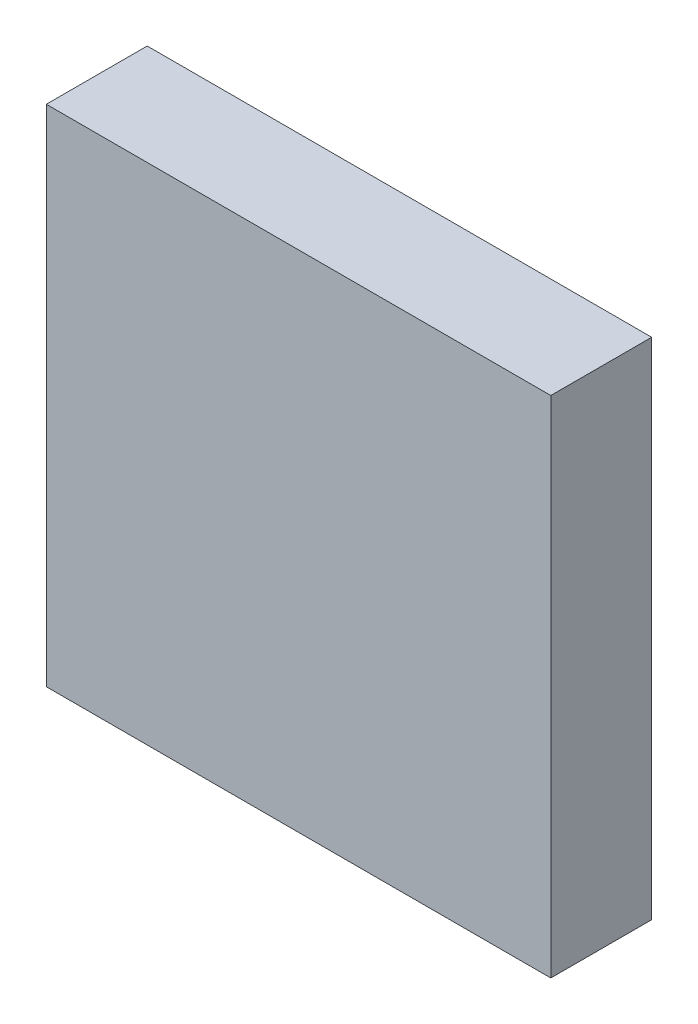
ISO-10303-21;
HEADER;
FILE_DESCRIPTION(('STEP AP214'),'2;1');
FILE_NAME('part.step','',(''),(''),'','','');
FILE_SCHEMA(('AUTOMOTIVE_DESIGN { 1 0 10303 214 1 1 1 1 }'));
ENDSEC;
DATA;
#1=APPLICATION_CONTEXT('core data for automotive mechanical design processes');
#2=APPLICATION_PROTOCOL_DEFINITION('international standard','automotive_design',2000,#1);
#3=PRODUCT_CONTEXT('',#1,'mechanical');
#4=PRODUCT('Part','Part','',(#3));
#5=PRODUCT_RELATED_PRODUCT_CATEGORY('part','',(#4));
#6=PRODUCT_DEFINITION_FORMATION('','',#4);
#7=PRODUCT_DEFINITION_CONTEXT('part definition',#1,'design');
#8=PRODUCT_DEFINITION('design','',#6,#7);
#9=PRODUCT_DEFINITION_SHAPE('','',#8);
#10=(LENGTH_UNIT() NAMED_UNIT(*) SI_UNIT(.MILLI.,.METRE.));
#11=(NAMED_UNIT(*) PLANE_ANGLE_UNIT() SI_UNIT($,.RADIAN.));
#12=(NAMED_UNIT(*) SI_UNIT($,.STERADIAN.) SOLID_ANGLE_UNIT());
#13=UNCERTAINTY_MEASURE_WITH_UNIT(LENGTH_MEASURE(1.E-05),#10,'distance_accuracy_value','');
#14=(GEOMETRIC_REPRESENTATION_CONTEXT(3) GLOBAL_UNCERTAINTY_ASSIGNED_CONTEXT((#13)) GLOBAL_UNIT_ASSIGNED_CONTEXT((#10,
#11,#12)) REPRESENTATION_CONTEXT('',''));
#15=CARTESIAN_POINT('',(0.,0.,0.));
#16=DIRECTION('',(0.,0.,1.));
#17=DIRECTION('',(1.,0.,0.));
#18=AXIS2_PLACEMENT_3D('',#15,#16,#17);
#19=CARTESIAN_POINT('',(-20.,0.,4.));
#20=DIRECTION('',(1.,0.,0.));
#21=DIRECTION('',(0.,0.,-1.));
#22=AXIS2_PLACEMENT_3D('',#19,#20,#21);
#23=PLANE('',#22);
#24=DIRECTION('',(0.,-1.,0.));
#25=VECTOR('',#24,1.);
#26=CARTESIAN_POINT('',(-20.,0.,0.));
#27=LINE('',#26,#25);
#28=CARTESIAN_POINT('',(-20.,0.,0.));
#29=VERTEX_POINT('',#28);
#30=CARTESIAN_POINT('',(-20.,-20.,0.));
#31=VERTEX_POINT('',#30);
#32=EDGE_CURVE('E96',#29,#31,#27,.T.);
#33=ORIENTED_EDGE('',*,*,#32,.T.);
#34=DIRECTION('',(0.,0.,-1.));
#35=VECTOR('',#34,1.);
#36=CARTESIAN_POINT('',(-20.,-20.,4.));
#37=LINE('',#36,#35);
#38=CARTESIAN_POINT('',(-20.,-20.,4.));
#39=VERTEX_POINT('',#38);
#40=EDGE_CURVE('E11',#39,#31,#37,.T.);
#41=ORIENTED_EDGE('',*,*,#40,.F.);
#42=DIRECTION('',(0.,-1.,0.));
#43=VECTOR('',#42,1.);
#44=CARTESIAN_POINT('',(-20.,0.,4.));
#45=LINE('',#44,#43);
#46=CARTESIAN_POINT('',(-20.,0.,4.));
#47=VERTEX_POINT('',#46);
#48=EDGE_CURVE('E84',#47,#39,#45,.T.);
#49=ORIENTED_EDGE('',*,*,#48,.F.);
#50=DIRECTION('',(0.,0.,-1.));
#51=VECTOR('',#50,1.);
#52=CARTESIAN_POINT('',(-20.,0.,4.));
#53=LINE('',#52,#51);
#54=EDGE_CURVE('E92',#47,#29,#53,.T.);
#55=ORIENTED_EDGE('',*,*,#54,.T.);
#56=EDGE_LOOP('',(#33,#41,#49,#55));
#57=FACE_BOUND('',#56,.T.);
#58=ADVANCED_FACE('F33',(#57),#23,.F.);
#59=CARTESIAN_POINT('',(-20.,-20.,4.));
#60=DIRECTION('',(0.,1.,0.));
#61=DIRECTION('',(0.,0.,1.));
#62=AXIS2_PLACEMENT_3D('',#59,#60,#61);
#63=PLANE('',#62);
#64=DIRECTION('',(1.,0.,0.));
#65=VECTOR('',#64,1.);
#66=CARTESIAN_POINT('',(-20.,-20.,0.));
#67=LINE('',#66,#65);
#68=CARTESIAN_POINT('',(0.,-20.,0.));
#69=VERTEX_POINT('',#68);
#70=EDGE_CURVE('E88',#31,#69,#67,.T.);
#71=ORIENTED_EDGE('',*,*,#70,.T.);
#72=DIRECTION('',(0.,0.,-1.));
#73=VECTOR('',#72,1.);
#74=CARTESIAN_POINT('',(0.,-20.,4.));
#75=LINE('',#74,#73);
#76=CARTESIAN_POINT('',(0.,-20.,4.));
#77=VERTEX_POINT('',#76);
#78=EDGE_CURVE('E41',#77,#69,#75,.T.);
#79=ORIENTED_EDGE('',*,*,#78,.F.);
#80=DIRECTION('',(1.,0.,0.));
#81=VECTOR('',#80,1.);
#82=CARTESIAN_POINT('',(-20.,-20.,4.));
#83=LINE('',#82,#81);
#84=EDGE_CURVE('E79',#39,#77,#83,.T.);
#85=ORIENTED_EDGE('',*,*,#84,.F.);
#86=ORIENTED_EDGE('',*,*,#40,.T.);
#87=EDGE_LOOP('',(#71,#79,#85,#86));
#88=FACE_BOUND('',#87,.T.);
#89=ADVANCED_FACE('F87',(#88),#63,.F.);
#90=CARTESIAN_POINT('',(0.,0.,4.));
#91=DIRECTION('',(-1.,0.,0.));
#92=DIRECTION('',(0.,0.,1.));
#93=AXIS2_PLACEMENT_3D('',#90,#91,#92);
#94=PLANE('',#93);
#95=DIRECTION('',(0.,1.,0.));
#96=VECTOR('',#95,1.);
#97=CARTESIAN_POINT('',(0.,0.,0.));
#98=LINE('',#97,#96);
#99=CARTESIAN_POINT('',(0.,0.,0.));
#100=VERTEX_POINT('',#99);
#101=EDGE_CURVE('E66',#69,#100,#98,.T.);
#102=ORIENTED_EDGE('',*,*,#101,.T.);
#103=DIRECTION('',(0.,0.,-1.));
#104=VECTOR('',#103,1.);
#105=CARTESIAN_POINT('',(0.,0.,4.));
#106=LINE('',#105,#104);
#107=CARTESIAN_POINT('',(0.,0.,4.));
#108=VERTEX_POINT('',#107);
#109=EDGE_CURVE('E89',#108,#100,#106,.T.);
#110=ORIENTED_EDGE('',*,*,#109,.F.);
#111=DIRECTION('',(0.,1.,0.));
#112=VECTOR('',#111,1.);
#113=CARTESIAN_POINT('',(0.,0.,4.));
#114=LINE('',#113,#112);
#115=EDGE_CURVE('E82',#77,#108,#114,.T.);
#116=ORIENTED_EDGE('',*,*,#115,.F.);
#117=ORIENTED_EDGE('',*,*,#78,.T.);
#118=EDGE_LOOP('',(#102,#110,#116,#117));
#119=FACE_BOUND('',#118,.T.);
#120=ADVANCED_FACE('F90',(#119),#94,.F.);
#121=CARTESIAN_POINT('',(-20.,0.,4.));
#122=DIRECTION('',(0.,-1.,0.));
#123=DIRECTION('',(0.,0.,-1.));
#124=AXIS2_PLACEMENT_3D('',#121,#122,#123);
#125=PLANE('',#124);
#126=DIRECTION('',(-1.,0.,0.));
#127=VECTOR('',#126,1.);
#128=CARTESIAN_POINT('',(-20.,0.,0.));
#129=LINE('',#128,#127);
#130=EDGE_CURVE('E72',#100,#29,#129,.T.);
#131=ORIENTED_EDGE('',*,*,#130,.T.);
#132=ORIENTED_EDGE('',*,*,#54,.F.);
#133=DIRECTION('',(-1.,0.,0.));
#134=VECTOR('',#133,1.);
#135=CARTESIAN_POINT('',(-20.,0.,4.));
#136=LINE('',#135,#134);
#137=EDGE_CURVE('E49',#108,#47,#136,.T.);
#138=ORIENTED_EDGE('',*,*,#137,.F.);
#139=ORIENTED_EDGE('',*,*,#109,.T.);
#140=EDGE_LOOP('',(#131,#132,#138,#139));
#141=FACE_BOUND('',#140,.T.);
#142=ADVANCED_FACE('F103',(#141),#125,.F.);
#143=CARTESIAN_POINT('',(0.,0.,4.));
#144=DIRECTION('',(0.,0.,1.));
#145=DIRECTION('',(1.,0.,0.));
#146=AXIS2_PLACEMENT_3D('',#143,#144,#145);
#147=PLANE('',#146);
#148=ORIENTED_EDGE('',*,*,#48,.T.);
#149=ORIENTED_EDGE('',*,*,#84,.T.);
#150=ORIENTED_EDGE('',*,*,#115,.T.);
#151=ORIENTED_EDGE('',*,*,#137,.T.);
#152=EDGE_LOOP('',(#148,#149,#150,#151));
#153=FACE_BOUND('',#152,.T.);
#154=ADVANCED_FACE('F80',(#153),#147,.T.);
#155=CARTESIAN_POINT('',(0.,0.,0.));
#156=DIRECTION('',(0.,0.,1.));
#157=DIRECTION('',(1.,0.,0.));
#158=AXIS2_PLACEMENT_3D('',#155,#156,#157);
#159=PLANE('',#158);
#160=ORIENTED_EDGE('',*,*,#32,.F.);
#161=ORIENTED_EDGE('',*,*,#130,.F.);
#162=ORIENTED_EDGE('',*,*,#101,.F.);
#163=ORIENTED_EDGE('',*,*,#70,.F.);
#164=EDGE_LOOP('',(#160,#161,#162,#163));
#165=FACE_BOUND('',#164,.T.);
#166=ADVANCED_FACE('F106',(#165),#159,.F.);
#167=CLOSED_SHELL('',(#58,#89,#120,#142,#154,#166));
#168=MANIFOLD_SOLID_BREP('B2',#167);
#169=ADVANCED_BREP_SHAPE_REPRESENTATION('',(#18,#168),#14);
#170=SHAPE_DEFINITION_REPRESENTATION(#9,#169);
ENDSEC;
END-ISO-10303-21;
